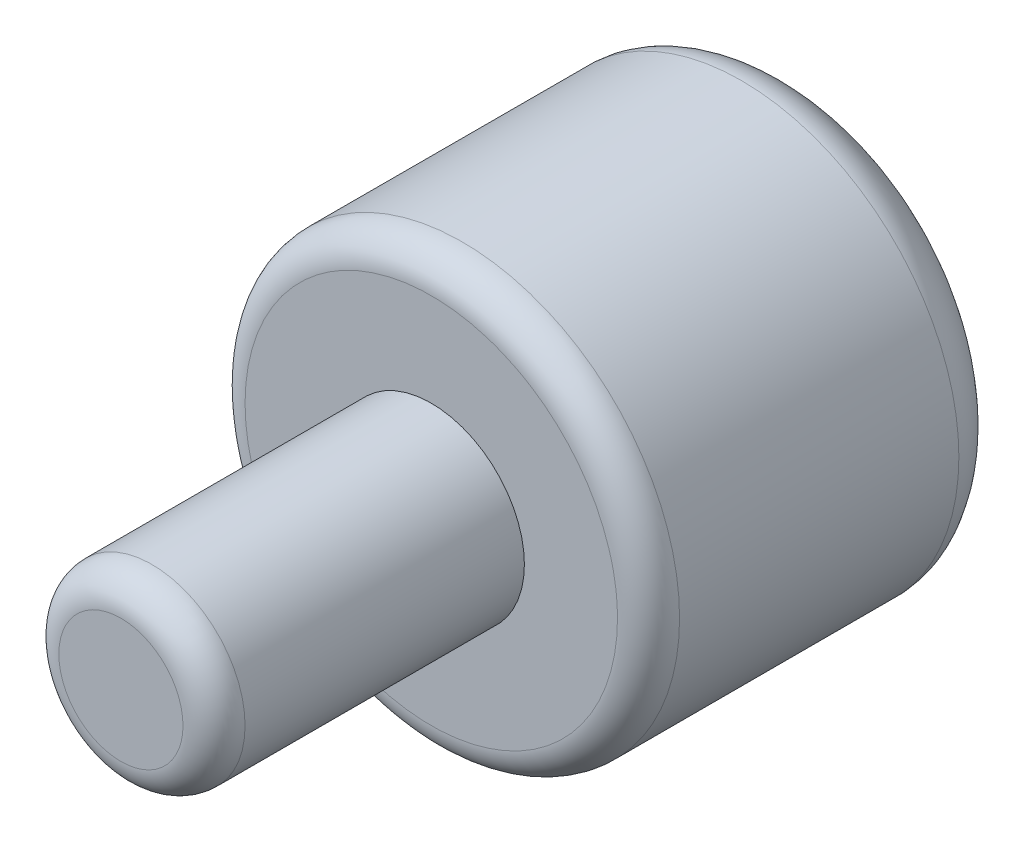
ISO-10303-21;
HEADER;
FILE_DESCRIPTION(('STEP AP214'),'2;1');
FILE_NAME('part.step','',(''),(''),'','','');
FILE_SCHEMA(('AUTOMOTIVE_DESIGN { 1 0 10303 214 1 1 1 1 }'));
ENDSEC;
DATA;
#1=APPLICATION_CONTEXT('core data for automotive mechanical design processes');
#2=APPLICATION_PROTOCOL_DEFINITION('international standard','automotive_design',2000,#1);
#3=PRODUCT_CONTEXT('',#1,'mechanical');
#4=PRODUCT('Part','Part','',(#3));
#5=PRODUCT_RELATED_PRODUCT_CATEGORY('part','',(#4));
#6=PRODUCT_DEFINITION_FORMATION('','',#4);
#7=PRODUCT_DEFINITION_CONTEXT('part definition',#1,'design');
#8=PRODUCT_DEFINITION('design','',#6,#7);
#9=PRODUCT_DEFINITION_SHAPE('','',#8);
#10=(LENGTH_UNIT() NAMED_UNIT(*) SI_UNIT(.MILLI.,.METRE.));
#11=(NAMED_UNIT(*) PLANE_ANGLE_UNIT() SI_UNIT($,.RADIAN.));
#12=(NAMED_UNIT(*) SI_UNIT($,.STERADIAN.) SOLID_ANGLE_UNIT());
#13=UNCERTAINTY_MEASURE_WITH_UNIT(LENGTH_MEASURE(1.E-05),#10,'distance_accuracy_value','');
#14=(GEOMETRIC_REPRESENTATION_CONTEXT(3) GLOBAL_UNCERTAINTY_ASSIGNED_CONTEXT((#13)) GLOBAL_UNIT_ASSIGNED_CONTEXT((#10,
#11,#12)) REPRESENTATION_CONTEXT('',''));
#15=CARTESIAN_POINT('',(0.,0.,0.));
#16=DIRECTION('',(0.,0.,1.));
#17=DIRECTION('',(1.,0.,0.));
#18=AXIS2_PLACEMENT_3D('',#15,#16,#17);
#19=CARTESIAN_POINT('',(0.,0.,10.));
#20=DIRECTION('',(0.,0.,1.));
#21=DIRECTION('',(1.,0.,0.));
#22=AXIS2_PLACEMENT_3D('',#19,#20,#21);
#23=PLANE('',#22);
#24=CARTESIAN_POINT('',(0.,0.,10.));
#25=DIRECTION('',(0.,0.,-1.));
#26=DIRECTION('',(1.,0.,0.));
#27=AXIS2_PLACEMENT_3D('',#24,#25,#26);
#28=CIRCLE('',#27,1.);
#29=CARTESIAN_POINT('',(1.,0.,10.));
#30=VERTEX_POINT('',#29);
#31=CARTESIAN_POINT('',(-1.,0.,10.));
#32=VERTEX_POINT('',#31);
#33=EDGE_CURVE('E52',#30,#32,#28,.T.);
#34=ORIENTED_EDGE('',*,*,#33,.F.);
#35=CARTESIAN_POINT('',(0.,0.,10.));
#36=DIRECTION('',(0.,0.,-1.));
#37=DIRECTION('',(-1.,0.,0.));
#38=AXIS2_PLACEMENT_3D('',#35,#36,#37);
#39=CIRCLE('',#38,1.);
#40=EDGE_CURVE('E47',#32,#30,#39,.T.);
#41=ORIENTED_EDGE('',*,*,#40,.F.);
#42=EDGE_LOOP('',(#34,#41));
#43=FACE_BOUND('',#42,.T.);
#44=ADVANCED_FACE('F17',(#43),#23,.T.);
#45=CARTESIAN_POINT('',(0.,0.,9.5));
#46=DIRECTION('',(0.,0.,1.));
#47=DIRECTION('',(-1.,0.,0.));
#48=AXIS2_PLACEMENT_3D('',#45,#46,#47);
#49=TOROIDAL_SURFACE('',#48,1.,0.5);
#50=CARTESIAN_POINT('',(0.,0.,9.5));
#51=DIRECTION('',(0.,0.,1.));
#52=DIRECTION('',(1.,0.,0.));
#53=AXIS2_PLACEMENT_3D('',#50,#51,#52);
#54=CIRCLE('',#53,1.5);
#55=CARTESIAN_POINT('',(1.5,0.,9.5));
#56=VERTEX_POINT('',#55);
#57=EDGE_CURVE('E58',#56,#56,#54,.F.);
#58=ORIENTED_EDGE('',*,*,#57,.F.);
#59=EDGE_LOOP('',(#58));
#60=FACE_BOUND('',#59,.T.);
#61=ORIENTED_EDGE('',*,*,#33,.T.);
#62=ORIENTED_EDGE('',*,*,#40,.T.);
#63=EDGE_LOOP('',(#61,#62));
#64=FACE_BOUND('',#63,.T.);
#65=ADVANCED_FACE('F57',(#60,#64),#49,.T.);
#66=CARTESIAN_POINT('',(0.,0.,7.5));
#67=DIRECTION('',(0.,0.,1.));
#68=DIRECTION('',(1.,0.,0.));
#69=AXIS2_PLACEMENT_3D('',#66,#67,#68);
#70=CYLINDRICAL_SURFACE('',#69,1.5);
#71=CARTESIAN_POINT('',(0.,0.,5.));
#72=DIRECTION('',(0.,0.,1.));
#73=DIRECTION('',(1.,0.,0.));
#74=AXIS2_PLACEMENT_3D('',#71,#72,#73);
#75=CIRCLE('',#74,1.5);
#76=CARTESIAN_POINT('',(1.5,0.,5.));
#77=VERTEX_POINT('',#76);
#78=EDGE_CURVE('E65',#77,#77,#75,.F.);
#79=ORIENTED_EDGE('',*,*,#78,.F.);
#80=EDGE_LOOP('',(#79));
#81=FACE_BOUND('',#80,.T.);
#82=ORIENTED_EDGE('',*,*,#57,.T.);
#83=EDGE_LOOP('',(#82));
#84=FACE_BOUND('',#83,.T.);
#85=ADVANCED_FACE('F75',(#81,#84),#70,.T.);
#86=CARTESIAN_POINT('',(0.,0.,5.));
#87=DIRECTION('',(0.,0.,1.));
#88=DIRECTION('',(1.,0.,0.));
#89=AXIS2_PLACEMENT_3D('',#86,#87,#88);
#90=PLANE('',#89);
#91=ORIENTED_EDGE('',*,*,#78,.T.);
#92=EDGE_LOOP('',(#91));
#93=FACE_BOUND('',#92,.T.);
#94=CARTESIAN_POINT('',(0.,0.,5.));
#95=DIRECTION('',(0.,0.,-1.));
#96=DIRECTION('',(1.,0.,0.));
#97=AXIS2_PLACEMENT_3D('',#94,#95,#96);
#98=CIRCLE('',#97,3.);
#99=CARTESIAN_POINT('',(3.,0.,5.));
#100=VERTEX_POINT('',#99);
#101=CARTESIAN_POINT('',(-3.,0.,5.));
#102=VERTEX_POINT('',#101);
#103=EDGE_CURVE('E95',#100,#102,#98,.T.);
#104=ORIENTED_EDGE('',*,*,#103,.F.);
#105=CARTESIAN_POINT('',(-3.,0.,5.));
#106=CARTESIAN_POINT('',(-3.00000081715766,0.0461999285744132,5.));
#107=CARTESIAN_POINT('',(-2.99893281410982,0.0923997917128602,5.));
#108=CARTESIAN_POINT('',(-2.99466503470442,0.184700960161577,5.));
#109=CARTESIAN_POINT('',(-2.99146525834686,0.230802265471847,5.));
#110=CARTESIAN_POINT('',(-2.98293979942335,0.322807891307967,5.));
#111=CARTESIAN_POINT('',(-2.97761411685738,0.368712211833817,5.));
#112=CARTESIAN_POINT('',(-2.96484846839385,0.46022591787748,5.));
#113=CARTESIAN_POINT('',(-2.95740850249627,0.505835303395293,5.));
#114=CARTESIAN_POINT('',(-2.94043009560714,0.596661803504133,5.));
#115=CARTESIAN_POINT('',(-2.93089165461558,0.641878918095158,5.));
#116=CARTESIAN_POINT('',(-2.90973667154858,0.73182438160565,5.));
#117=CARTESIAN_POINT('',(-2.89812012947313,0.776552730525115,5.));
#118=CARTESIAN_POINT('',(-2.87283372956379,0.865425209907387,5.));
#119=CARTESIAN_POINT('',(-2.8591638717299,0.909569340370192,5.));
#120=CARTESIAN_POINT('',(-2.8298000138159,0.997179177121216,5.));
#121=CARTESIAN_POINT('',(-2.8141060137358,1.04064488340943,5.));
#122=CARTESIAN_POINT('',(-2.78072736269034,1.12680511371348,5.));
#123=CARTESIAN_POINT('',(-2.76304271172498,1.16949963772931,5.));
#124=CARTESIAN_POINT('',(-2.72572049920314,1.25402639150206,5.00000000000001));
#125=CARTESIAN_POINT('',(-2.70608293764666,1.29585862125897,5.00000000000002));
#126=CARTESIAN_POINT('',(-2.66489681048371,1.37857151340026,4.99999999999998));
#127=CARTESIAN_POINT('',(-2.64334824487725,1.41945217578464,4.99999999999993));
#128=CARTESIAN_POINT('',(-2.59838609900097,1.5001746956165,5.00000000000007));
#129=CARTESIAN_POINT('',(-2.57497251873114,1.54001655306399,5.00000000000027));
#130=CARTESIAN_POINT('',(-2.52633029564654,1.61857642420014,4.99999999999973));
#131=CARTESIAN_POINT('',(-2.50110165283176,1.6572944378888,4.99999999999898));
#132=CARTESIAN_POINT('',(-2.44888319475805,1.73352404864675,5.00000000000102));
#133=CARTESIAN_POINT('',(-2.42189337949911,1.77103564571604,5.0000000000038));
#134=CARTESIAN_POINT('',(-2.36620998418232,1.8447721725595,4.99999999999621));
#135=CARTESIAN_POINT('',(-2.33751640412447,1.88099710233368,4.99999999998584));
#136=CARTESIAN_POINT('',(-2.27848742177281,1.95208373157809,5.00000000001416));
#137=CARTESIAN_POINT('',(-2.248152019479,1.98694543104833,5.00000000005284));
#138=CARTESIAN_POINT('',(-2.18590148384495,2.05522843083101,4.99999999994716));
#139=CARTESIAN_POINT('',(-2.1539863505047,2.08864973114345,4.99999999980281));
#140=CARTESIAN_POINT('',(-2.08732905183639,2.15531642760149,5.00000000020519));
#141=CARTESIAN_POINT('',(-2.05252472355244,2.18849967616555,5.0000000007802));
#142=CARTESIAN_POINT('',(-1.98137972034041,2.25317706460451,4.99999999654723));
#143=CARTESIAN_POINT('',(-1.94503903777602,2.28467119608203,4.99999999173923));
#144=CARTESIAN_POINT('',(-1.87089946200015,2.34589278353399,4.9999999654993));
#145=CARTESIAN_POINT('',(-1.83310052566365,2.3756201871947,4.99999994406688));
#146=CARTESIAN_POINT('',(-1.7465111821613,2.44046217045476,4.999999826378));
#147=CARTESIAN_POINT('',(-1.69733544236826,2.47506545960949,4.99999971275423));
#148=CARTESIAN_POINT('',(-1.61708077569853,2.52798664438555,4.99999947484956));
#149=CARTESIAN_POINT('',(-1.5866384653783,2.54727829489286,4.99999937304583));
#150=CARTESIAN_POINT('',(-1.51478946480339,2.59095170673878,4.99999922271662));
#151=CARTESIAN_POINT('',(-1.47310970970556,2.61488728002847,4.99999920325233));
#152=CARTESIAN_POINT('',(-1.38861923936395,2.66065453722473,4.99999929003934));
#153=CARTESIAN_POINT('',(-1.34580861787179,2.68248639484145,4.99999939628026));
#154=CARTESIAN_POINT('',(-1.25917663272807,2.7240373102022,4.99999966471282));
#155=CARTESIAN_POINT('',(-1.21535542511839,2.74375669150851,4.99999982689587));
#156=CARTESIAN_POINT('',(-1.14889884851777,2.77158184082938,4.99999996624028));
#157=CARTESIAN_POINT('',(-1.12662679654178,2.78056423553814,4.99999999536767));
#158=CARTESIAN_POINT('',(-1.09707742294565,2.79220358934917,5.00000000149418));
#159=CARTESIAN_POINT('',(-1.08986337027577,2.79502336848946,5.00000000043987));
#160=CARTESIAN_POINT('',(-1.04314891281968,2.81309014544332,4.99999999539587));
#161=CARTESIAN_POINT('',(-1.0033553371301,2.82759129678505,4.99999999932759));
#162=CARTESIAN_POINT('',(-0.921004106914508,2.85562868397773,4.99999998486207));
#163=CARTESIAN_POINT('',(-0.878413866069112,2.86906948823029,4.99999996523828));
#164=CARTESIAN_POINT('',(-0.817059974786639,2.88694184709492,4.99999992469065));
#165=CARTESIAN_POINT('',(-0.798518888445806,2.89215039430684,4.99999991085117));
#166=CARTESIAN_POINT('',(-0.73581040881921,2.90911039087099,4.99999986235748));
#167=CARTESIAN_POINT('',(-0.691411739617103,2.92002606132878,4.99999982521478));
#168=CARTESIAN_POINT('',(-0.618587679665076,2.93614846104174,4.99999978505207));
#169=CARTESIAN_POINT('',(-0.590296988988793,2.94197780611923,4.99999977450483));
#170=CARTESIAN_POINT('',(-0.507491900008373,2.95777861998108,4.99999976136101));
#171=CARTESIAN_POINT('',(-0.452759127391042,2.96663652336004,4.99999977496612));
#172=CARTESIAN_POINT('',(-0.353879784851171,2.97981507330686,4.99999981787744));
#173=CARTESIAN_POINT('',(-0.309805187593635,2.98468884651099,4.9999998434994));
#174=CARTESIAN_POINT('',(-0.221482716361601,2.9924608662589,4.9999999005892));
#175=CARTESIAN_POINT('',(-0.17723485171795,2.99535921775133,4.99999993205673));
#176=CARTESIAN_POINT('',(-0.0886572834919088,2.99916313301933,4.99999998125347));
#177=CARTESIAN_POINT('',(-0.044327586074994,3.00006884124716,4.99999999898367));
#178=CARTESIAN_POINT('',(0.0443703360322752,2.99993109236167,5.00000000101731));
#179=CARTESIAN_POINT('',(0.0887385566482682,2.99888575461186,4.99999998528849));
#180=CARTESIAN_POINT('',(0.177387900921751,2.99489838196327,4.99999996644101));
#181=CARTESIAN_POINT('',(0.221669029863338,2.99195646593435,4.99999996332157));
#182=CARTESIAN_POINT('',(0.310056973875679,2.98414316502026,4.9999999941256));
#183=CARTESIAN_POINT('',(0.354163790023487,2.97927179207581,5.00000002804884));
#184=CARTESIAN_POINT('',(0.453147458321501,2.96626255534099,4.99999996311382));
#185=CARTESIAN_POINT('',(0.507959885716462,2.9576125106743,4.99999982893656));
#186=CARTESIAN_POINT('',(0.57902326722645,2.94415065774966,4.99999975377568));
#187=CARTESIAN_POINT('',(0.595568583649867,2.9408560062783,4.9999997433282));
#188=CARTESIAN_POINT('',(0.661075911603405,2.92720604182938,4.99999973557526));
#189=CARTESIAN_POINT('',(0.709806602484341,2.91570603392257,4.99999980450863));
#190=CARTESIAN_POINT('',(0.784218633610618,2.8961750027887,4.99999987911846));
#191=CARTESIAN_POINT('',(0.81013078624295,2.88900135669188,4.99999989930582));
#192=CARTESIAN_POINT('',(0.873241541930616,2.87061079155261,4.99999994328316));
#193=CARTESIAN_POINT('',(0.910330850395169,2.8590152789234,4.99999996467809));
#194=CARTESIAN_POINT('',(0.988014473004113,2.83306603111552,4.99999999311383));
#195=CARTESIAN_POINT('',(1.02855461134494,2.81854965196265,4.9999999983544));
#196=CARTESIAN_POINT('',(1.08063458640169,2.79865278092504,4.99999999997851));
#197=CARTESIAN_POINT('',(1.09247366625126,2.79404508634294,5.00000000000138));
#198=CARTESIAN_POINT('',(1.12663042360491,2.78050964001248,4.9999999999974));
#199=CARTESIAN_POINT('',(1.14887426954114,2.77139487119781,4.99999999990799));
#200=CARTESIAN_POINT('',(1.2152692468378,2.74325926623332,5.00000000017416));
#201=CARTESIAN_POINT('',(1.25908741299985,2.72344580630067,5.00000000106403));
#202=CARTESIAN_POINT('',(1.34573389756099,2.68176529278702,4.99999999211998));
#203=CARTESIAN_POINT('',(1.38856220436585,2.65989821516715,4.99999998228594));
#204=CARTESIAN_POINT('',(1.47313379041175,2.61414993578394,4.9999999347641));
#205=CARTESIAN_POINT('',(1.51487702573357,2.5902686526594,4.99999989707519));
#206=CARTESIAN_POINT('',(1.58690023591675,2.54677851867715,4.99999974754416));
#207=CARTESIAN_POINT('',(1.61743777543605,2.52759356793525,4.99999965658897));
#208=CARTESIAN_POINT('',(1.69787748667285,2.47498115269263,4.9999994016306));
#209=CARTESIAN_POINT('',(1.74714430824887,2.44057092068819,4.99999922929202));
#210=CARTESIAN_POINT('',(1.83379251594882,2.37592605853906,4.99999915144051));
#211=CARTESIAN_POINT('',(1.8715803868668,2.34623263078947,4.99999919945777));
#212=CARTESIAN_POINT('',(1.94566084385561,2.285038093499,4.99999941215572));
#213=CARTESIAN_POINT('',(1.98195361203933,2.25353720524327,4.99999957682214));
#214=CARTESIAN_POINT('',(2.05282697415992,2.18868362346625,4.99999985615169));
#215=CARTESIAN_POINT('',(2.08740790365726,2.15533129561146,4.99999997082465));
#216=CARTESIAN_POINT('',(2.14034877968865,2.10223663178108,5.00000001637043));
#217=CARTESIAN_POINT('',(2.1591667494183,2.0829455596123,5.00000000582291));
#218=CARTESIAN_POINT('',(2.19967167138964,2.04029639292873,4.99999999215314));
#219=CARTESIAN_POINT('',(2.22125468925621,2.01683915117506,4.99999999073948));
#220=CARTESIAN_POINT('',(2.27167825657758,1.96026962713548,4.9999999625421));
#221=CARTESIAN_POINT('',(2.30018208381687,1.92685601722109,4.9999999263807));
#222=CARTESIAN_POINT('',(2.34318345476367,1.87414211192235,4.99999984986016));
#223=CARTESIAN_POINT('',(2.35820477772497,1.85526670231062,4.99999981873482));
#224=CARTESIAN_POINT('',(2.38676409859477,1.81846711443605,4.99999975758807));
#225=CARTESIAN_POINT('',(2.40033302607472,1.80056689531927,4.99999972763815));
#226=CARTESIAN_POINT('',(2.4464315011856,1.73829196459475,4.99999963202211));
#227=CARTESIAN_POINT('',(2.47793714481758,1.69314964574596,4.99999957750741));
#228=CARTESIAN_POINT('',(2.52793388379289,1.61705004272669,4.99999955520715));
#229=CARTESIAN_POINT('',(2.54716428831469,1.58657344568903,4.99999956398441));
#230=CARTESIAN_POINT('',(2.59072803702384,1.51466877375922,4.99999960237242));
#231=CARTESIAN_POINT('',(2.61462644138395,1.47297553378521,4.99999963795087));
#232=CARTESIAN_POINT('',(2.6603660819384,1.38848141440974,4.99999973104215));
#233=CARTESIAN_POINT('',(2.68220744708786,1.3456806046562,4.99999978855362));
#234=CARTESIAN_POINT('',(2.72378758491551,1.25907136336088,4.99999989712274));
#235=CARTESIAN_POINT('',(2.74352654420247,1.21526302166765,4.99999994818096));
#236=CARTESIAN_POINT('',(2.7715133443834,1.14887361503849,4.99999999127629));
#237=CARTESIAN_POINT('',(2.7805719667188,1.12663110100146,5.00000000005943));
#238=CARTESIAN_POINT('',(2.7974861918308,1.08364412825623,4.99999999994512));
#239=CARTESIAN_POINT('',(2.8053808332134,1.06291501814613,4.99999999234695));
#240=CARTESIAN_POINT('',(2.82839529712092,1.00048506726835,4.99999996796085));
#241=CARTESIAN_POINT('',(2.84284793646529,0.958536159048763,4.99999994957973));
#242=CARTESIAN_POINT('',(2.8699430414412,0.874060763408355,4.99999994122094));
#243=CARTESIAN_POINT('',(2.8825855898909,0.831534302510173,4.99999995124198));
#244=CARTESIAN_POINT('',(2.9060114667502,0.745972066180685,5.00000000331053));
#245=CARTESIAN_POINT('',(2.91679475807634,0.702936280609033,5.00000004535867));
#246=CARTESIAN_POINT('',(2.93411899059807,0.627266336401264,4.99999993944242));
#247=CARTESIAN_POINT('',(2.94104665296998,0.594720643028569,4.99999983634));
#248=CARTESIAN_POINT('',(2.95437807202424,0.525532152588518,4.99999974668796));
#249=CARTESIAN_POINT('',(2.96062371363807,0.488858787131496,4.9999997753163));
#250=CARTESIAN_POINT('',(2.97465774138038,0.396099994863574,4.99999985054809));
#251=CARTESIAN_POINT('',(2.98154862232146,0.339878095471057,4.99999989873145));
#252=CARTESIAN_POINT('',(2.99262442436249,0.22177203481521,4.99999996935161));
#253=CARTESIAN_POINT('',(2.99648993802841,0.159857550226846,4.99999998890631));
#254=CARTESIAN_POINT('',(2.99949725164705,0.0652680511928765,5.00000000078244));
#255=CARTESIAN_POINT('',(3.00000916840468,0.0326321486226944,5.0000000016154));
#256=CARTESIAN_POINT('',(3.,0.,5.));
#257=B_SPLINE_CURVE_WITH_KNOTS('',3,(#105,#106,#107,#108,#109,#110,#111,#112,#113,#114,#115,
#116,#117,#118,#119,#120,#121,#122,#123,#124,#125,#126,#127,#128,#129,#130,#131,#132,#133,#134,
#135,#136,#137,#138,#139,#140,#141,#142,#143,#144,#145,#146,#147,#148,#149,#150,#151,#152,#153,
#154,#155,#156,#157,#158,#159,#160,#161,#162,#163,#164,#165,#166,#167,#168,#169,#170,#171,#172,
#173,#174,#175,#176,#177,#178,#179,#180,#181,#182,#183,#184,#185,#186,#187,#188,#189,#190,#191,
#192,#193,#194,#195,#196,#197,#198,#199,#200,#201,#202,#203,#204,#205,#206,#207,#208,#209,#210,
#211,#212,#213,#214,#215,#216,#217,#218,#219,#220,#221,#222,#223,#224,#225,#226,#227,#228,#229,
#230,#231,#232,#233,#234,#235,#236,#237,#238,#239,#240,#241,#242,#243,#244,#245,#246,#247,#248,
#249,#250,#251,#252,#253,#254,#255,#256),.UNSPECIFIED.,.F.,.F.,(4,2,2,2,2,2,2,2,2,2,2,2,2,2,2,2,
2,2,2,2,2,2,2,2,2,2,2,2,2,2,2,2,2,2,2,2,2,2,2,2,2,2,2,2,2,2,2,2,2,2,2,2,2,2,2,2,2,2,2,2,2,2,2,2,
2,2,2,2,2,2,2,2,2,2,2,4),(0.,0.138587349918007,0.277174699836015,0.415762049754023,
0.55434939967203,0.692936749590035,0.831524099508045,0.970111449426044,1.10869879934405,
1.24728614926206,1.38587349918007,1.52446084909807,1.66304819901608,1.80163554893409,
1.94022289885209,2.0788102487701,2.21739759868811,2.35598494860611,2.50019489284992,
2.64440555396121,2.78862048309877,2.96889099649892,3.07699205673506,3.22111810681327,
3.36523224575325,3.50932427946512,3.58136434846161,3.60460112493283,3.7316222140346,
3.86555455259243,3.92332923691155,4.06043154187559,4.14707838341616,4.31331330769262,
4.44630268357683,4.57928499355581,4.71225766295953,4.84535857250535,4.97845114063521,
5.11154288511493,5.27791060566423,5.32851987993882,5.47864607758684,5.55929999350475,
5.67584840173096,5.80498679774209,5.84309864401062,5.9152091613903,6.05941871271577,
6.20362995231293,6.34784701992656,6.45602058105996,6.63617212877703,6.78029499243888,
6.9244002488101,7.06847714440216,7.14931939619325,7.24493086182159,7.37664332896864,
7.44900587922312,7.5163873265363,7.6814326404108,7.78952312292196,7.93363267195258,
8.07773318078004,8.22182088862213,8.29386407986472,8.36040425708272,8.4934669151954,
8.6265234832675,8.75958270488681,8.8593874732995,8.97096150162952,9.14079914306771,
9.32677774914321,9.42467882107267),.UNSPECIFIED.);
#258=EDGE_CURVE('E36',#100,#102,#257,.F.);
#259=ORIENTED_EDGE('',*,*,#258,.T.);
#260=EDGE_LOOP('',(#104,#259));
#261=FACE_BOUND('',#260,.T.);
#262=ADVANCED_FACE('F134',(#93,#261),#90,.T.);
#263=CARTESIAN_POINT('',(0.,0.,-1.5));
#264=CARTESIAN_POINT('',(-1.09955742876,0.,-1.5));
#265=CARTESIAN_POINT('',(-2.20014075177,0.,-1.31547749393));
#266=CARTESIAN_POINT('',(-3.06944748584,0.,-0.942917465044));
#267=CARTESIAN_POINT('',(-3.5,0.,-0.471238898038));
#268=CARTESIAN_POINT('',(-3.5,0.,0.));
#269=(BOUNDED_CURVE() B_SPLINE_CURVE(5,(#263,#264,#265,#266,#267,#268),.UNSPECIFIED.,.F.,
.F.) B_SPLINE_CURVE_WITH_KNOTS((6,6),(17.9442426306,23.9256568408),
.UNSPECIFIED.) CURVE() GEOMETRIC_REPRESENTATION_ITEM() RATIONAL_B_SPLINE_CURVE((1.,1.,1.,1.,1.,1.)) REPRESENTATION_ITEM(''));
#270=CARTESIAN_POINT('',(0.,0.,-0.75));
#271=DIRECTION('',(0.,0.,1.));
#272=AXIS1_PLACEMENT('',#270,#271);
#273=SURFACE_OF_REVOLUTION('',#269,#272);
#274=CARTESIAN_POINT('',(0.,0.,0.));
#275=DIRECTION('',(0.,0.,1.));
#276=DIRECTION('',(1.,0.,0.));
#277=AXIS2_PLACEMENT_3D('',#274,#275,#276);
#278=CIRCLE('',#277,3.5);
#279=CARTESIAN_POINT('',(3.5,0.,0.));
#280=VERTEX_POINT('',#279);
#281=EDGE_CURVE('E28',#280,#280,#278,.T.);
#282=ORIENTED_EDGE('',*,*,#281,.F.);
#283=EDGE_LOOP('',(#282));
#284=FACE_BOUND('',#283,.T.);
#285=CARTESIAN_POINT('',(0.,0.,-1.5));
#286=VERTEX_POINT('',#285);
#287=VERTEX_LOOP('',#286);
#288=FACE_BOUND('',#287,.T.);
#289=ADVANCED_FACE('F119',(#284,#288),#273,.T.);
#290=CARTESIAN_POINT('',(0.,0.,4.5));
#291=DIRECTION('',(0.,0.,1.));
#292=DIRECTION('',(-1.,0.,0.));
#293=AXIS2_PLACEMENT_3D('',#290,#291,#292);
#294=TOROIDAL_SURFACE('',#293,3.,0.5);
#295=CARTESIAN_POINT('',(0.,0.,4.5));
#296=DIRECTION('',(0.,0.,1.));
#297=DIRECTION('',(1.,0.,0.));
#298=AXIS2_PLACEMENT_3D('',#295,#296,#297);
#299=CIRCLE('',#298,3.5);
#300=CARTESIAN_POINT('',(3.5,0.,4.5));
#301=VERTEX_POINT('',#300);
#302=EDGE_CURVE('E11',#301,#301,#299,.F.);
#303=ORIENTED_EDGE('',*,*,#302,.F.);
#304=EDGE_LOOP('',(#303));
#305=FACE_BOUND('',#304,.T.);
#306=ORIENTED_EDGE('',*,*,#258,.F.);
#307=ORIENTED_EDGE('',*,*,#103,.T.);
#308=EDGE_LOOP('',(#306,#307));
#309=FACE_BOUND('',#308,.T.);
#310=ADVANCED_FACE('F107',(#305,#309),#294,.T.);
#311=CARTESIAN_POINT('',(0.,0.,2.5));
#312=DIRECTION('',(0.,0.,1.));
#313=DIRECTION('',(1.,0.,0.));
#314=AXIS2_PLACEMENT_3D('',#311,#312,#313);
#315=CYLINDRICAL_SURFACE('',#314,3.5);
#316=ORIENTED_EDGE('',*,*,#281,.T.);
#317=EDGE_LOOP('',(#316));
#318=FACE_BOUND('',#317,.T.);
#319=ORIENTED_EDGE('',*,*,#302,.T.);
#320=EDGE_LOOP('',(#319));
#321=FACE_BOUND('',#320,.T.);
#322=ADVANCED_FACE('F118',(#318,#321),#315,.T.);
#323=CLOSED_SHELL('',(#44,#65,#85,#262,#289,#310,#322));
#324=MANIFOLD_SOLID_BREP('B1',#323);
#325=ADVANCED_BREP_SHAPE_REPRESENTATION('',(#18,#324),#14);
#326=SHAPE_DEFINITION_REPRESENTATION(#9,#325);
ENDSEC;
END-ISO-10303-21;
